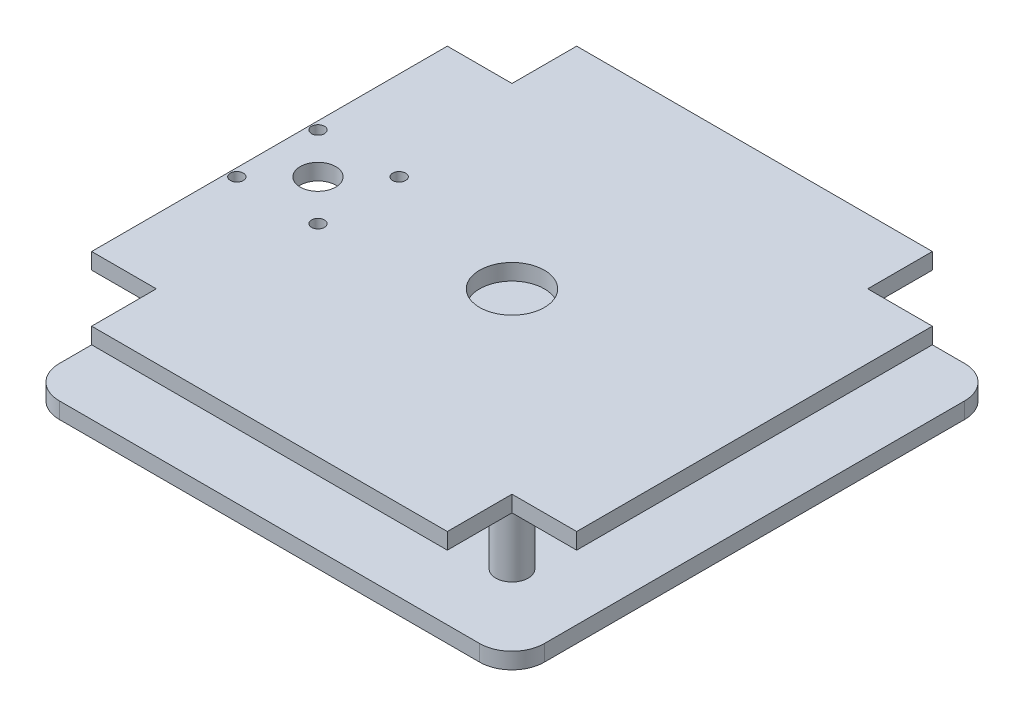
ISO-10303-21;
HEADER;
FILE_DESCRIPTION(('STEP AP214'),'2;1');
FILE_NAME('part.step','',(''),(''),'','','');
FILE_SCHEMA(('AUTOMOTIVE_DESIGN { 1 0 10303 214 1 1 1 1 }'));
ENDSEC;
DATA;
#1=APPLICATION_CONTEXT('core data for automotive mechanical design processes');
#2=APPLICATION_PROTOCOL_DEFINITION('international standard','automotive_design',2000,#1);
#3=PRODUCT_CONTEXT('',#1,'mechanical');
#4=PRODUCT('Part','Part','',(#3));
#5=PRODUCT_RELATED_PRODUCT_CATEGORY('part','',(#4));
#6=PRODUCT_DEFINITION_FORMATION('','',#4);
#7=PRODUCT_DEFINITION_CONTEXT('part definition',#1,'design');
#8=PRODUCT_DEFINITION('design','',#6,#7);
#9=PRODUCT_DEFINITION_SHAPE('','',#8);
#10=(LENGTH_UNIT() NAMED_UNIT(*) SI_UNIT(.MILLI.,.METRE.));
#11=(NAMED_UNIT(*) PLANE_ANGLE_UNIT() SI_UNIT($,.RADIAN.));
#12=(NAMED_UNIT(*) SI_UNIT($,.STERADIAN.) SOLID_ANGLE_UNIT());
#13=UNCERTAINTY_MEASURE_WITH_UNIT(LENGTH_MEASURE(1.E-05),#10,'distance_accuracy_value','');
#14=(GEOMETRIC_REPRESENTATION_CONTEXT(3) GLOBAL_UNCERTAINTY_ASSIGNED_CONTEXT((#13)) GLOBAL_UNIT_ASSIGNED_CONTEXT((#10,
#11,#12)) REPRESENTATION_CONTEXT('',''));
#15=CARTESIAN_POINT('',(0.,0.,0.));
#16=DIRECTION('',(0.,0.,1.));
#17=DIRECTION('',(1.,0.,0.));
#18=AXIS2_PLACEMENT_3D('',#15,#16,#17);
#19=CARTESIAN_POINT('',(75.,5.,-75.));
#20=DIRECTION('',(-1.,0.,0.));
#21=DIRECTION('',(0.,0.,1.));
#22=AXIS2_PLACEMENT_3D('',#19,#20,#21);
#23=PLANE('',#22);
#24=DIRECTION('',(0.,0.,-1.));
#25=VECTOR('',#24,1.);
#26=CARTESIAN_POINT('',(75.,5.,-75.));
#27=LINE('',#26,#25);
#28=CARTESIAN_POINT('',(75.,5.,65.));
#29=VERTEX_POINT('',#28);
#30=CARTESIAN_POINT('',(75.,5.,-65.));
#31=VERTEX_POINT('',#30);
#32=EDGE_CURVE('E264',#29,#31,#27,.T.);
#33=ORIENTED_EDGE('',*,*,#32,.F.);
#34=DIRECTION('',(0.,-1.,0.));
#35=VECTOR('',#34,1.);
#36=CARTESIAN_POINT('',(75.,5.,65.));
#37=LINE('',#36,#35);
#38=CARTESIAN_POINT('',(75.,0.,65.));
#39=VERTEX_POINT('',#38);
#40=EDGE_CURVE('E317',#29,#39,#37,.T.);
#41=ORIENTED_EDGE('',*,*,#40,.T.);
#42=DIRECTION('',(0.,0.,-1.));
#43=VECTOR('',#42,1.);
#44=CARTESIAN_POINT('',(75.,0.,-75.));
#45=LINE('',#44,#43);
#46=CARTESIAN_POINT('',(75.,0.,-65.));
#47=VERTEX_POINT('',#46);
#48=EDGE_CURVE('E261',#39,#47,#45,.T.);
#49=ORIENTED_EDGE('',*,*,#48,.T.);
#50=DIRECTION('',(0.,-1.,0.));
#51=VECTOR('',#50,1.);
#52=CARTESIAN_POINT('',(75.,5.,-65.));
#53=LINE('',#52,#51);
#54=EDGE_CURVE('E315',#47,#31,#53,.F.);
#55=ORIENTED_EDGE('',*,*,#54,.T.);
#56=EDGE_LOOP('',(#33,#41,#49,#55));
#57=FACE_BOUND('',#56,.T.);
#58=ADVANCED_FACE('F40',(#57),#23,.F.);
#59=CARTESIAN_POINT('',(-75.,5.,-75.));
#60=DIRECTION('',(0.,0.,1.));
#61=DIRECTION('',(1.,0.,0.));
#62=AXIS2_PLACEMENT_3D('',#59,#60,#61);
#63=PLANE('',#62);
#64=DIRECTION('',(-1.,0.,0.));
#65=VECTOR('',#64,1.);
#66=CARTESIAN_POINT('',(-75.,5.,-75.));
#67=LINE('',#66,#65);
#68=CARTESIAN_POINT('',(65.,5.,-75.));
#69=VERTEX_POINT('',#68);
#70=CARTESIAN_POINT('',(-65.,5.,-75.));
#71=VERTEX_POINT('',#70);
#72=EDGE_CURVE('E267',#69,#71,#67,.T.);
#73=ORIENTED_EDGE('',*,*,#72,.F.);
#74=DIRECTION('',(0.,-1.,0.));
#75=VECTOR('',#74,1.);
#76=CARTESIAN_POINT('',(65.,5.,-75.));
#77=LINE('',#76,#75);
#78=CARTESIAN_POINT('',(65.,0.,-75.));
#79=VERTEX_POINT('',#78);
#80=EDGE_CURVE('E322',#69,#79,#77,.T.);
#81=ORIENTED_EDGE('',*,*,#80,.T.);
#82=DIRECTION('',(-1.,0.,0.));
#83=VECTOR('',#82,1.);
#84=CARTESIAN_POINT('',(-75.,0.,-75.));
#85=LINE('',#84,#83);
#86=CARTESIAN_POINT('',(-65.,0.,-75.));
#87=VERTEX_POINT('',#86);
#88=EDGE_CURVE('E280',#79,#87,#85,.T.);
#89=ORIENTED_EDGE('',*,*,#88,.T.);
#90=DIRECTION('',(0.,-1.,0.));
#91=VECTOR('',#90,1.);
#92=CARTESIAN_POINT('',(-65.,5.,-75.));
#93=LINE('',#92,#91);
#94=EDGE_CURVE('E320',#87,#71,#93,.F.);
#95=ORIENTED_EDGE('',*,*,#94,.T.);
#96=EDGE_LOOP('',(#73,#81,#89,#95));
#97=FACE_BOUND('',#96,.T.);
#98=ADVANCED_FACE('F472',(#97),#63,.F.);
#99=CARTESIAN_POINT('',(-75.,5.,-75.));
#100=DIRECTION('',(1.,0.,0.));
#101=DIRECTION('',(0.,0.,-1.));
#102=AXIS2_PLACEMENT_3D('',#99,#100,#101);
#103=PLANE('',#102);
#104=DIRECTION('',(0.,0.,1.));
#105=VECTOR('',#104,1.);
#106=CARTESIAN_POINT('',(-75.,0.,-75.));
#107=LINE('',#106,#105);
#108=CARTESIAN_POINT('',(-75.,0.,-65.));
#109=VERTEX_POINT('',#108);
#110=CARTESIAN_POINT('',(-75.,0.,65.));
#111=VERTEX_POINT('',#110);
#112=EDGE_CURVE('E283',#109,#111,#107,.T.);
#113=ORIENTED_EDGE('',*,*,#112,.T.);
#114=DIRECTION('',(0.,-1.,0.));
#115=VECTOR('',#114,1.);
#116=CARTESIAN_POINT('',(-75.,5.,65.));
#117=LINE('',#116,#115);
#118=CARTESIAN_POINT('',(-75.,5.,65.));
#119=VERTEX_POINT('',#118);
#120=EDGE_CURVE('E305',#111,#119,#117,.F.);
#121=ORIENTED_EDGE('',*,*,#120,.T.);
#122=DIRECTION('',(0.,0.,1.));
#123=VECTOR('',#122,1.);
#124=CARTESIAN_POINT('',(-75.,5.,-75.));
#125=LINE('',#124,#123);
#126=CARTESIAN_POINT('',(-75.,5.,-65.));
#127=VERTEX_POINT('',#126);
#128=EDGE_CURVE('E271',#127,#119,#125,.T.);
#129=ORIENTED_EDGE('',*,*,#128,.F.);
#130=DIRECTION('',(0.,-1.,0.));
#131=VECTOR('',#130,1.);
#132=CARTESIAN_POINT('',(-75.,5.,-65.));
#133=LINE('',#132,#131);
#134=EDGE_CURVE('E302',#127,#109,#133,.T.);
#135=ORIENTED_EDGE('',*,*,#134,.T.);
#136=EDGE_LOOP('',(#113,#121,#129,#135));
#137=FACE_BOUND('',#136,.T.);
#138=ADVANCED_FACE('F475',(#137),#103,.F.);
#139=CARTESIAN_POINT('',(-75.,5.,75.));
#140=DIRECTION('',(0.,0.,-1.));
#141=DIRECTION('',(-1.,0.,0.));
#142=AXIS2_PLACEMENT_3D('',#139,#140,#141);
#143=PLANE('',#142);
#144=DIRECTION('',(1.,0.,0.));
#145=VECTOR('',#144,1.);
#146=CARTESIAN_POINT('',(-75.,5.,75.));
#147=LINE('',#146,#145);
#148=CARTESIAN_POINT('',(-65.,5.,75.));
#149=VERTEX_POINT('',#148);
#150=CARTESIAN_POINT('',(65.,5.,75.));
#151=VERTEX_POINT('',#150);
#152=EDGE_CURVE('E274',#149,#151,#147,.T.);
#153=ORIENTED_EDGE('',*,*,#152,.F.);
#154=DIRECTION('',(0.,-1.,0.));
#155=VECTOR('',#154,1.);
#156=CARTESIAN_POINT('',(-65.,5.,75.));
#157=LINE('',#156,#155);
#158=CARTESIAN_POINT('',(-65.,0.,75.));
#159=VERTEX_POINT('',#158);
#160=EDGE_CURVE('E291',#149,#159,#157,.T.);
#161=ORIENTED_EDGE('',*,*,#160,.T.);
#162=DIRECTION('',(1.,0.,0.));
#163=VECTOR('',#162,1.);
#164=CARTESIAN_POINT('',(-75.,0.,75.));
#165=LINE('',#164,#163);
#166=CARTESIAN_POINT('',(65.,0.,75.));
#167=VERTEX_POINT('',#166);
#168=EDGE_CURVE('E268',#159,#167,#165,.T.);
#169=ORIENTED_EDGE('',*,*,#168,.T.);
#170=DIRECTION('',(0.,-1.,0.));
#171=VECTOR('',#170,1.);
#172=CARTESIAN_POINT('',(65.,5.,75.));
#173=LINE('',#172,#171);
#174=EDGE_CURVE('E277',#167,#151,#173,.F.);
#175=ORIENTED_EDGE('',*,*,#174,.T.);
#176=EDGE_LOOP('',(#153,#161,#169,#175));
#177=FACE_BOUND('',#176,.T.);
#178=ADVANCED_FACE('F433',(#177),#143,.F.);
#179=CARTESIAN_POINT('',(0.,5.,0.));
#180=DIRECTION('',(0.,1.,0.));
#181=DIRECTION('',(0.,0.,1.));
#182=AXIS2_PLACEMENT_3D('',#179,#180,#181);
#183=PLANE('',#182);
#184=CARTESIAN_POINT('',(-60.,5.,0.));
#185=DIRECTION('',(0.,1.,0.));
#186=DIRECTION('',(0.,0.,1.));
#187=AXIS2_PLACEMENT_3D('',#184,#185,#186);
#188=CIRCLE('',#187,5.5);
#189=CARTESIAN_POINT('',(-60.,5.,5.5));
#190=VERTEX_POINT('',#189);
#191=EDGE_CURVE('E221',#190,#190,#188,.T.);
#192=ORIENTED_EDGE('',*,*,#191,.F.);
#193=EDGE_LOOP('',(#192));
#194=FACE_BOUND('',#193,.T.);
#195=CARTESIAN_POINT('',(0.,5.,0.));
#196=DIRECTION('',(0.,1.,0.));
#197=DIRECTION('',(0.,0.,1.));
#198=AXIS2_PLACEMENT_3D('',#195,#196,#197);
#199=CIRCLE('',#198,10.);
#200=CARTESIAN_POINT('',(0.,5.,10.));
#201=VERTEX_POINT('',#200);
#202=EDGE_CURVE('E237',#201,#201,#199,.T.);
#203=ORIENTED_EDGE('',*,*,#202,.F.);
#204=EDGE_LOOP('',(#203));
#205=FACE_BOUND('',#204,.T.);
#206=CARTESIAN_POINT('',(-50.,5.,-49.9999999999972));
#207=DIRECTION('',(0.,1.,0.));
#208=DIRECTION('',(0.,0.,1.));
#209=AXIS2_PLACEMENT_3D('',#206,#207,#208);
#210=CIRCLE('',#209,5.000000000003);
#211=CARTESIAN_POINT('',(-50.,5.,-44.9999999999942));
#212=VERTEX_POINT('',#211);
#213=EDGE_CURVE('E236',#212,#212,#210,.T.);
#214=ORIENTED_EDGE('',*,*,#213,.F.);
#215=EDGE_LOOP('',(#214));
#216=FACE_BOUND('',#215,.T.);
#217=CARTESIAN_POINT('',(-49.9999999999972,5.,50.0000000000028));
#218=DIRECTION('',(0.,1.,0.));
#219=DIRECTION('',(0.,0.,1.));
#220=AXIS2_PLACEMENT_3D('',#217,#218,#219);
#221=CIRCLE('',#220,5.00000000000206);
#222=CARTESIAN_POINT('',(-49.9999999999972,5.,55.0000000000049));
#223=VERTEX_POINT('',#222);
#224=EDGE_CURVE('E243',#223,#223,#221,.T.);
#225=ORIENTED_EDGE('',*,*,#224,.F.);
#226=EDGE_LOOP('',(#225));
#227=FACE_BOUND('',#226,.T.);
#228=CARTESIAN_POINT('',(50.0000000000028,5.,50.));
#229=DIRECTION('',(0.,1.,0.));
#230=DIRECTION('',(0.,0.,1.));
#231=AXIS2_PLACEMENT_3D('',#228,#229,#230);
#232=CIRCLE('',#231,4.99999999999929);
#233=CARTESIAN_POINT('',(50.0000000000028,5.,54.9999999999993));
#234=VERTEX_POINT('',#233);
#235=EDGE_CURVE('E249',#234,#234,#232,.T.);
#236=ORIENTED_EDGE('',*,*,#235,.F.);
#237=EDGE_LOOP('',(#236));
#238=FACE_BOUND('',#237,.T.);
#239=CARTESIAN_POINT('',(50.,5.,-50.));
#240=DIRECTION('',(0.,1.,0.));
#241=DIRECTION('',(0.,0.,1.));
#242=AXIS2_PLACEMENT_3D('',#239,#240,#241);
#243=CIRCLE('',#242,5.);
#244=CARTESIAN_POINT('',(50.,5.,-45.));
#245=VERTEX_POINT('',#244);
#246=EDGE_CURVE('E255',#245,#245,#243,.T.);
#247=ORIENTED_EDGE('',*,*,#246,.F.);
#248=EDGE_LOOP('',(#247));
#249=FACE_BOUND('',#248,.T.);
#250=ORIENTED_EDGE('',*,*,#128,.T.);
#251=CARTESIAN_POINT('',(-65.,5.,65.));
#252=DIRECTION('',(0.,1.,0.));
#253=DIRECTION('',(0.,0.,1.));
#254=AXIS2_PLACEMENT_3D('',#251,#252,#253);
#255=CIRCLE('',#254,10.);
#256=EDGE_CURVE('E313',#119,#149,#255,.T.);
#257=ORIENTED_EDGE('',*,*,#256,.T.);
#258=ORIENTED_EDGE('',*,*,#152,.T.);
#259=CARTESIAN_POINT('',(65.,5.,65.));
#260=DIRECTION('',(0.,1.,0.));
#261=DIRECTION('',(0.,0.,1.));
#262=AXIS2_PLACEMENT_3D('',#259,#260,#261);
#263=CIRCLE('',#262,10.);
#264=EDGE_CURVE('E311',#151,#29,#263,.T.);
#265=ORIENTED_EDGE('',*,*,#264,.T.);
#266=ORIENTED_EDGE('',*,*,#32,.T.);
#267=CARTESIAN_POINT('',(65.,5.,-65.));
#268=DIRECTION('',(0.,1.,0.));
#269=DIRECTION('',(0.,0.,1.));
#270=AXIS2_PLACEMENT_3D('',#267,#268,#269);
#271=CIRCLE('',#270,10.);
#272=EDGE_CURVE('E309',#31,#69,#271,.T.);
#273=ORIENTED_EDGE('',*,*,#272,.T.);
#274=ORIENTED_EDGE('',*,*,#72,.T.);
#275=CARTESIAN_POINT('',(-65.,5.,-65.));
#276=DIRECTION('',(0.,1.,0.));
#277=DIRECTION('',(0.,0.,1.));
#278=AXIS2_PLACEMENT_3D('',#275,#276,#277);
#279=CIRCLE('',#278,10.);
#280=EDGE_CURVE('E307',#71,#127,#279,.T.);
#281=ORIENTED_EDGE('',*,*,#280,.T.);
#282=EDGE_LOOP('',(#250,#257,#258,#265,#266,#273,#274,#281));
#283=FACE_BOUND('',#282,.T.);
#284=ADVANCED_FACE('F429',(#194,#205,#216,#227,#238,#249,#283),#183,.T.);
#285=CARTESIAN_POINT('',(0.,0.,0.));
#286=DIRECTION('',(0.,1.,0.));
#287=DIRECTION('',(0.,0.,1.));
#288=AXIS2_PLACEMENT_3D('',#285,#286,#287);
#289=PLANE('',#288);
#290=CARTESIAN_POINT('',(-60.,0.,0.));
#291=DIRECTION('',(0.,1.,0.));
#292=DIRECTION('',(0.,0.,1.));
#293=AXIS2_PLACEMENT_3D('',#290,#291,#292);
#294=CIRCLE('',#293,5.5);
#295=CARTESIAN_POINT('',(-60.,0.,5.5));
#296=VERTEX_POINT('',#295);
#297=EDGE_CURVE('E232',#296,#296,#294,.T.);
#298=ORIENTED_EDGE('',*,*,#297,.T.);
#299=EDGE_LOOP('',(#298));
#300=FACE_BOUND('',#299,.T.);
#301=CARTESIAN_POINT('',(0.,0.,0.));
#302=DIRECTION('',(0.,1.,0.));
#303=DIRECTION('',(0.,0.,1.));
#304=AXIS2_PLACEMENT_3D('',#301,#302,#303);
#305=CIRCLE('',#304,10.);
#306=CARTESIAN_POINT('',(0.,0.,10.));
#307=VERTEX_POINT('',#306);
#308=EDGE_CURVE('E233',#307,#307,#305,.T.);
#309=ORIENTED_EDGE('',*,*,#308,.T.);
#310=EDGE_LOOP('',(#309));
#311=FACE_BOUND('',#310,.T.);
#312=ORIENTED_EDGE('',*,*,#168,.F.);
#313=CARTESIAN_POINT('',(-65.,0.,65.));
#314=DIRECTION('',(0.,1.,0.));
#315=DIRECTION('',(0.,0.,1.));
#316=AXIS2_PLACEMENT_3D('',#313,#314,#315);
#317=CIRCLE('',#316,10.);
#318=EDGE_CURVE('E300',#159,#111,#317,.F.);
#319=ORIENTED_EDGE('',*,*,#318,.T.);
#320=ORIENTED_EDGE('',*,*,#112,.F.);
#321=CARTESIAN_POINT('',(-65.,0.,-65.));
#322=DIRECTION('',(0.,1.,0.));
#323=DIRECTION('',(0.,0.,1.));
#324=AXIS2_PLACEMENT_3D('',#321,#322,#323);
#325=CIRCLE('',#324,10.);
#326=EDGE_CURVE('E294',#109,#87,#325,.F.);
#327=ORIENTED_EDGE('',*,*,#326,.T.);
#328=ORIENTED_EDGE('',*,*,#88,.F.);
#329=CARTESIAN_POINT('',(65.,0.,-65.));
#330=DIRECTION('',(0.,1.,0.));
#331=DIRECTION('',(0.,0.,1.));
#332=AXIS2_PLACEMENT_3D('',#329,#330,#331);
#333=CIRCLE('',#332,10.);
#334=EDGE_CURVE('E296',#79,#47,#333,.F.);
#335=ORIENTED_EDGE('',*,*,#334,.T.);
#336=ORIENTED_EDGE('',*,*,#48,.F.);
#337=CARTESIAN_POINT('',(65.,0.,65.));
#338=DIRECTION('',(0.,1.,0.));
#339=DIRECTION('',(0.,0.,1.));
#340=AXIS2_PLACEMENT_3D('',#337,#338,#339);
#341=CIRCLE('',#340,10.);
#342=EDGE_CURVE('E298',#39,#167,#341,.F.);
#343=ORIENTED_EDGE('',*,*,#342,.T.);
#344=EDGE_LOOP('',(#312,#319,#320,#327,#328,#335,#336,#343));
#345=FACE_BOUND('',#344,.T.);
#346=ADVANCED_FACE('F432',(#300,#311,#345),#289,.F.);
#347=CARTESIAN_POINT('',(50.,25.,-50.));
#348=DIRECTION('',(0.,-1.,0.));
#349=DIRECTION('',(0.,0.,-1.));
#350=AXIS2_PLACEMENT_3D('',#347,#348,#349);
#351=CYLINDRICAL_SURFACE('',#350,5.);
#352=CARTESIAN_POINT('',(50.,25.,-50.));
#353=DIRECTION('',(0.,1.,0.));
#354=DIRECTION('',(0.,0.,1.));
#355=AXIS2_PLACEMENT_3D('',#352,#353,#354);
#356=CIRCLE('',#355,5.);
#357=CARTESIAN_POINT('',(50.,25.,-45.));
#358=VERTEX_POINT('',#357);
#359=EDGE_CURVE('E258',#358,#358,#356,.T.);
#360=ORIENTED_EDGE('',*,*,#359,.F.);
#361=EDGE_LOOP('',(#360));
#362=FACE_BOUND('',#361,.T.);
#363=ORIENTED_EDGE('',*,*,#246,.T.);
#364=EDGE_LOOP('',(#363));
#365=FACE_BOUND('',#364,.T.);
#366=ADVANCED_FACE('F521',(#362,#365),#351,.T.);
#367=CARTESIAN_POINT('',(50.0000000000028,25.,50.));
#368=DIRECTION('',(0.,-1.,0.));
#369=DIRECTION('',(0.,0.,-1.));
#370=AXIS2_PLACEMENT_3D('',#367,#368,#369);
#371=CYLINDRICAL_SURFACE('',#370,4.99999999999929);
#372=CARTESIAN_POINT('',(50.0000000000028,25.,50.));
#373=DIRECTION('',(0.,1.,0.));
#374=DIRECTION('',(0.,0.,1.));
#375=AXIS2_PLACEMENT_3D('',#372,#373,#374);
#376=CIRCLE('',#375,4.99999999999929);
#377=CARTESIAN_POINT('',(50.0000000000028,25.,54.9999999999993));
#378=VERTEX_POINT('',#377);
#379=EDGE_CURVE('E252',#378,#378,#376,.T.);
#380=ORIENTED_EDGE('',*,*,#379,.F.);
#381=EDGE_LOOP('',(#380));
#382=FACE_BOUND('',#381,.T.);
#383=ORIENTED_EDGE('',*,*,#235,.T.);
#384=EDGE_LOOP('',(#383));
#385=FACE_BOUND('',#384,.T.);
#386=ADVANCED_FACE('F517',(#382,#385),#371,.T.);
#387=CARTESIAN_POINT('',(-49.9999999999972,25.,50.0000000000028));
#388=DIRECTION('',(0.,-1.,0.));
#389=DIRECTION('',(0.,0.,-1.));
#390=AXIS2_PLACEMENT_3D('',#387,#388,#389);
#391=CYLINDRICAL_SURFACE('',#390,5.00000000000206);
#392=CARTESIAN_POINT('',(-49.9999999999972,25.,50.0000000000028));
#393=DIRECTION('',(0.,1.,0.));
#394=DIRECTION('',(0.,0.,1.));
#395=AXIS2_PLACEMENT_3D('',#392,#393,#394);
#396=CIRCLE('',#395,5.00000000000206);
#397=CARTESIAN_POINT('',(-49.9999999999972,25.,55.0000000000049));
#398=VERTEX_POINT('',#397);
#399=EDGE_CURVE('E246',#398,#398,#396,.T.);
#400=ORIENTED_EDGE('',*,*,#399,.F.);
#401=EDGE_LOOP('',(#400));
#402=FACE_BOUND('',#401,.T.);
#403=ORIENTED_EDGE('',*,*,#224,.T.);
#404=EDGE_LOOP('',(#403));
#405=FACE_BOUND('',#404,.T.);
#406=ADVANCED_FACE('F425',(#402,#405),#391,.T.);
#407=CARTESIAN_POINT('',(-50.,25.,-49.9999999999972));
#408=DIRECTION('',(0.,-1.,0.));
#409=DIRECTION('',(0.,0.,-1.));
#410=AXIS2_PLACEMENT_3D('',#407,#408,#409);
#411=CYLINDRICAL_SURFACE('',#410,5.000000000003);
#412=CARTESIAN_POINT('',(-50.,25.,-49.9999999999972));
#413=DIRECTION('',(0.,1.,0.));
#414=DIRECTION('',(0.,0.,1.));
#415=AXIS2_PLACEMENT_3D('',#412,#413,#414);
#416=CIRCLE('',#415,5.000000000003);
#417=CARTESIAN_POINT('',(-50.,25.,-44.9999999999942));
#418=VERTEX_POINT('',#417);
#419=EDGE_CURVE('E240',#418,#418,#416,.T.);
#420=ORIENTED_EDGE('',*,*,#419,.F.);
#421=EDGE_LOOP('',(#420));
#422=FACE_BOUND('',#421,.T.);
#423=ORIENTED_EDGE('',*,*,#213,.T.);
#424=EDGE_LOOP('',(#423));
#425=FACE_BOUND('',#424,.T.);
#426=ADVANCED_FACE('F421',(#422,#425),#411,.T.);
#427=CARTESIAN_POINT('',(0.,0.,0.));
#428=DIRECTION('',(0.,1.,0.));
#429=DIRECTION('',(0.,0.,1.));
#430=AXIS2_PLACEMENT_3D('',#427,#428,#429);
#431=CYLINDRICAL_SURFACE('',#430,10.);
#432=ORIENTED_EDGE('',*,*,#308,.F.);
#433=EDGE_LOOP('',(#432));
#434=FACE_BOUND('',#433,.T.);
#435=ORIENTED_EDGE('',*,*,#202,.T.);
#436=EDGE_LOOP('',(#435));
#437=FACE_BOUND('',#436,.T.);
#438=ADVANCED_FACE('F424',(#434,#437),#431,.F.);
#439=CARTESIAN_POINT('',(-60.,-15.,0.));
#440=DIRECTION('',(0.,1.,0.));
#441=DIRECTION('',(0.,0.,1.));
#442=AXIS2_PLACEMENT_3D('',#439,#440,#441);
#443=CYLINDRICAL_SURFACE('',#442,5.5);
#444=ORIENTED_EDGE('',*,*,#191,.T.);
#445=EDGE_LOOP('',(#444));
#446=FACE_BOUND('',#445,.T.);
#447=ORIENTED_EDGE('',*,*,#297,.F.);
#448=EDGE_LOOP('',(#447));
#449=FACE_BOUND('',#448,.T.);
#450=ADVANCED_FACE('F491',(#446,#449),#443,.F.);
#451=CARTESIAN_POINT('',(-65.,5.,65.));
#452=DIRECTION('',(0.,-1.,0.));
#453=DIRECTION('',(0.,0.,-1.));
#454=AXIS2_PLACEMENT_3D('',#451,#452,#453);
#455=CYLINDRICAL_SURFACE('',#454,10.);
#456=ORIENTED_EDGE('',*,*,#256,.F.);
#457=ORIENTED_EDGE('',*,*,#120,.F.);
#458=ORIENTED_EDGE('',*,*,#318,.F.);
#459=ORIENTED_EDGE('',*,*,#160,.F.);
#460=EDGE_LOOP('',(#456,#457,#458,#459));
#461=FACE_BOUND('',#460,.T.);
#462=ADVANCED_FACE('F451',(#461),#455,.T.);
#463=CARTESIAN_POINT('',(65.,5.,65.));
#464=DIRECTION('',(0.,-1.,0.));
#465=DIRECTION('',(0.,0.,-1.));
#466=AXIS2_PLACEMENT_3D('',#463,#464,#465);
#467=CYLINDRICAL_SURFACE('',#466,10.);
#468=ORIENTED_EDGE('',*,*,#264,.F.);
#469=ORIENTED_EDGE('',*,*,#174,.F.);
#470=ORIENTED_EDGE('',*,*,#342,.F.);
#471=ORIENTED_EDGE('',*,*,#40,.F.);
#472=EDGE_LOOP('',(#468,#469,#470,#471));
#473=FACE_BOUND('',#472,.T.);
#474=ADVANCED_FACE('F461',(#473),#467,.T.);
#475=CARTESIAN_POINT('',(65.,5.,-65.));
#476=DIRECTION('',(0.,-1.,0.));
#477=DIRECTION('',(0.,0.,-1.));
#478=AXIS2_PLACEMENT_3D('',#475,#476,#477);
#479=CYLINDRICAL_SURFACE('',#478,10.);
#480=ORIENTED_EDGE('',*,*,#272,.F.);
#481=ORIENTED_EDGE('',*,*,#54,.F.);
#482=ORIENTED_EDGE('',*,*,#334,.F.);
#483=ORIENTED_EDGE('',*,*,#80,.F.);
#484=EDGE_LOOP('',(#480,#481,#482,#483));
#485=FACE_BOUND('',#484,.T.);
#486=ADVANCED_FACE('F469',(#485),#479,.T.);
#487=CARTESIAN_POINT('',(-65.,5.,-65.));
#488=DIRECTION('',(0.,-1.,0.));
#489=DIRECTION('',(0.,0.,-1.));
#490=AXIS2_PLACEMENT_3D('',#487,#488,#489);
#491=CYLINDRICAL_SURFACE('',#490,10.);
#492=ORIENTED_EDGE('',*,*,#280,.F.);
#493=ORIENTED_EDGE('',*,*,#94,.F.);
#494=ORIENTED_EDGE('',*,*,#326,.F.);
#495=ORIENTED_EDGE('',*,*,#134,.F.);
#496=EDGE_LOOP('',(#492,#493,#494,#495));
#497=FACE_BOUND('',#496,.T.);
#498=ADVANCED_FACE('F42',(#497),#491,.T.);
#499=CARTESIAN_POINT('',(0.,30.,-75.));
#500=DIRECTION('',(0.,0.,1.));
#501=DIRECTION('',(1.,0.,0.));
#502=AXIS2_PLACEMENT_3D('',#499,#500,#501);
#503=PLANE('',#502);
#504=DIRECTION('',(-1.,0.,0.));
#505=VECTOR('',#504,1.);
#506=CARTESIAN_POINT('',(0.,30.,-75.));
#507=LINE('',#506,#505);
#508=CARTESIAN_POINT('',(55.,30.,-75.0000000000125));
#509=VERTEX_POINT('',#508);
#510=CARTESIAN_POINT('',(-55.,30.,-75.));
#511=VERTEX_POINT('',#510);
#512=EDGE_CURVE('E197',#509,#511,#507,.T.);
#513=ORIENTED_EDGE('',*,*,#512,.F.);
#514=DIRECTION('',(0.,1.,0.));
#515=VECTOR('',#514,1.);
#516=CARTESIAN_POINT('',(55.,20.,-75.0000000000125));
#517=LINE('',#516,#515);
#518=CARTESIAN_POINT('',(55.,25.,-75.0000000000125));
#519=VERTEX_POINT('',#518);
#520=EDGE_CURVE('E177',#519,#509,#517,.T.);
#521=ORIENTED_EDGE('',*,*,#520,.F.);
#522=DIRECTION('',(-1.,0.,0.));
#523=VECTOR('',#522,1.);
#524=CARTESIAN_POINT('',(0.,25.,-75.));
#525=LINE('',#524,#523);
#526=CARTESIAN_POINT('',(-55.,25.,-75.));
#527=VERTEX_POINT('',#526);
#528=EDGE_CURVE('E222',#519,#527,#525,.T.);
#529=ORIENTED_EDGE('',*,*,#528,.T.);
#530=DIRECTION('',(0.,1.,0.));
#531=VECTOR('',#530,1.);
#532=CARTESIAN_POINT('',(-55.,20.,-75.));
#533=LINE('',#532,#531);
#534=EDGE_CURVE('E203',#527,#511,#533,.T.);
#535=ORIENTED_EDGE('',*,*,#534,.T.);
#536=EDGE_LOOP('',(#513,#521,#529,#535));
#537=FACE_BOUND('',#536,.T.);
#538=ADVANCED_FACE('F202',(#537),#503,.F.);
#539=CARTESIAN_POINT('',(-75.,30.,0.));
#540=DIRECTION('',(1.,0.,0.));
#541=DIRECTION('',(0.,0.,-1.));
#542=AXIS2_PLACEMENT_3D('',#539,#540,#541);
#543=PLANE('',#542);
#544=DIRECTION('',(0.,0.,1.));
#545=VECTOR('',#544,1.);
#546=CARTESIAN_POINT('',(-75.,25.,0.));
#547=LINE('',#546,#545);
#548=CARTESIAN_POINT('',(-75.,25.,-55.));
#549=VERTEX_POINT('',#548);
#550=CARTESIAN_POINT('',(-74.9999999999875,25.,55.));
#551=VERTEX_POINT('',#550);
#552=EDGE_CURVE('E224',#549,#551,#547,.T.);
#553=ORIENTED_EDGE('',*,*,#552,.T.);
#554=DIRECTION('',(0.,1.,0.));
#555=VECTOR('',#554,1.);
#556=CARTESIAN_POINT('',(-74.9999999999875,20.,55.));
#557=LINE('',#556,#555);
#558=CARTESIAN_POINT('',(-74.9999999999875,30.,55.));
#559=VERTEX_POINT('',#558);
#560=EDGE_CURVE('E355',#551,#559,#557,.T.);
#561=ORIENTED_EDGE('',*,*,#560,.T.);
#562=DIRECTION('',(0.,0.,1.));
#563=VECTOR('',#562,1.);
#564=CARTESIAN_POINT('',(-75.,30.,0.));
#565=LINE('',#564,#563);
#566=CARTESIAN_POINT('',(-75.,30.,-55.));
#567=VERTEX_POINT('',#566);
#568=EDGE_CURVE('E204',#567,#559,#565,.T.);
#569=ORIENTED_EDGE('',*,*,#568,.F.);
#570=DIRECTION('',(0.,1.,0.));
#571=VECTOR('',#570,1.);
#572=CARTESIAN_POINT('',(-75.,20.,-55.));
#573=LINE('',#572,#571);
#574=EDGE_CURVE('E367',#549,#567,#573,.T.);
#575=ORIENTED_EDGE('',*,*,#574,.F.);
#576=EDGE_LOOP('',(#553,#561,#569,#575));
#577=FACE_BOUND('',#576,.T.);
#578=ADVANCED_FACE('F500',(#577),#543,.F.);
#579=CARTESIAN_POINT('',(0.,30.,75.));
#580=DIRECTION('',(0.,0.,-1.));
#581=DIRECTION('',(-1.,0.,0.));
#582=AXIS2_PLACEMENT_3D('',#579,#580,#581);
#583=PLANE('',#582);
#584=DIRECTION('',(1.,0.,0.));
#585=VECTOR('',#584,1.);
#586=CARTESIAN_POINT('',(0.,30.,75.));
#587=LINE('',#586,#585);
#588=CARTESIAN_POINT('',(-54.9999999999875,30.,75.0000000000001));
#589=VERTEX_POINT('',#588);
#590=CARTESIAN_POINT('',(55.0000000000125,30.,74.9999999999876));
#591=VERTEX_POINT('',#590);
#592=EDGE_CURVE('E208',#589,#591,#587,.T.);
#593=ORIENTED_EDGE('',*,*,#592,.F.);
#594=DIRECTION('',(0.,1.,0.));
#595=VECTOR('',#594,1.);
#596=CARTESIAN_POINT('',(-54.9999999999875,20.,75.0000000000001));
#597=LINE('',#596,#595);
#598=CARTESIAN_POINT('',(-54.9999999999875,25.,75.0000000000001));
#599=VERTEX_POINT('',#598);
#600=EDGE_CURVE('E347',#599,#589,#597,.T.);
#601=ORIENTED_EDGE('',*,*,#600,.F.);
#602=DIRECTION('',(1.,0.,0.));
#603=VECTOR('',#602,1.);
#604=CARTESIAN_POINT('',(0.,25.,75.));
#605=LINE('',#604,#603);
#606=CARTESIAN_POINT('',(55.0000000000125,25.,74.9999999999876));
#607=VERTEX_POINT('',#606);
#608=EDGE_CURVE('E211',#599,#607,#605,.T.);
#609=ORIENTED_EDGE('',*,*,#608,.T.);
#610=DIRECTION('',(0.,1.,0.));
#611=VECTOR('',#610,1.);
#612=CARTESIAN_POINT('',(55.0000000000125,20.,74.9999999999876));
#613=LINE('',#612,#611);
#614=EDGE_CURVE('E199',#607,#591,#613,.T.);
#615=ORIENTED_EDGE('',*,*,#614,.T.);
#616=EDGE_LOOP('',(#593,#601,#609,#615));
#617=FACE_BOUND('',#616,.T.);
#618=ADVANCED_FACE('F351',(#617),#583,.F.);
#619=CARTESIAN_POINT('',(75.,30.,0.));
#620=DIRECTION('',(-1.,0.,0.));
#621=DIRECTION('',(0.,0.,1.));
#622=AXIS2_PLACEMENT_3D('',#619,#620,#621);
#623=PLANE('',#622);
#624=DIRECTION('',(0.,0.,-1.));
#625=VECTOR('',#624,1.);
#626=CARTESIAN_POINT('',(75.,30.,0.));
#627=LINE('',#626,#625);
#628=CARTESIAN_POINT('',(75.0000000000125,30.,54.9999999999875));
#629=VERTEX_POINT('',#628);
#630=CARTESIAN_POINT('',(75.,30.,-55.0000000000125));
#631=VERTEX_POINT('',#630);
#632=EDGE_CURVE('E219',#629,#631,#627,.T.);
#633=ORIENTED_EDGE('',*,*,#632,.F.);
#634=DIRECTION('',(0.,1.,0.));
#635=VECTOR('',#634,1.);
#636=CARTESIAN_POINT('',(75.0000000000125,20.,54.9999999999875));
#637=LINE('',#636,#635);
#638=CARTESIAN_POINT('',(75.0000000000125,25.,54.9999999999875));
#639=VERTEX_POINT('',#638);
#640=EDGE_CURVE('E768',#639,#629,#637,.T.);
#641=ORIENTED_EDGE('',*,*,#640,.F.);
#642=DIRECTION('',(0.,0.,-1.));
#643=VECTOR('',#642,1.);
#644=CARTESIAN_POINT('',(75.,25.,0.));
#645=LINE('',#644,#643);
#646=CARTESIAN_POINT('',(75.,25.,-55.0000000000125));
#647=VERTEX_POINT('',#646);
#648=EDGE_CURVE('E205',#639,#647,#645,.T.);
#649=ORIENTED_EDGE('',*,*,#648,.T.);
#650=DIRECTION('',(0.,1.,0.));
#651=VECTOR('',#650,1.);
#652=CARTESIAN_POINT('',(75.,20.,-55.0000000000125));
#653=LINE('',#652,#651);
#654=EDGE_CURVE('E365',#647,#631,#653,.T.);
#655=ORIENTED_EDGE('',*,*,#654,.T.);
#656=EDGE_LOOP('',(#633,#641,#649,#655));
#657=FACE_BOUND('',#656,.T.);
#658=ADVANCED_FACE('F662',(#657),#623,.F.);
#659=CARTESIAN_POINT('',(0.,30.,0.));
#660=DIRECTION('',(0.,1.,0.));
#661=DIRECTION('',(0.,0.,1.));
#662=AXIS2_PLACEMENT_3D('',#659,#660,#661);
#663=PLANE('',#662);
#664=DIRECTION('',(-1.,0.,0.));
#665=VECTOR('',#664,1.);
#666=CARTESIAN_POINT('',(-54.9999999999875,30.,55.));
#667=LINE('',#666,#665);
#668=CARTESIAN_POINT('',(-54.9999999999875,30.,55.));
#669=VERTEX_POINT('',#668);
#670=EDGE_CURVE('E353',#669,#559,#667,.T.);
#671=ORIENTED_EDGE('',*,*,#670,.F.);
#672=DIRECTION('',(0.,0.,-1.));
#673=VECTOR('',#672,1.);
#674=CARTESIAN_POINT('',(-54.9999999999875,30.,75.0000000000001));
#675=LINE('',#674,#673);
#676=EDGE_CURVE('E357',#589,#669,#675,.T.);
#677=ORIENTED_EDGE('',*,*,#676,.F.);
#678=ORIENTED_EDGE('',*,*,#592,.T.);
#679=DIRECTION('',(0.,0.,1.));
#680=VECTOR('',#679,1.);
#681=CARTESIAN_POINT('',(55.0000000000125,30.,54.9999999999875));
#682=LINE('',#681,#680);
#683=CARTESIAN_POINT('',(55.0000000000125,30.,54.9999999999875));
#684=VERTEX_POINT('',#683);
#685=EDGE_CURVE('E765',#684,#591,#682,.T.);
#686=ORIENTED_EDGE('',*,*,#685,.F.);
#687=DIRECTION('',(-1.,0.,0.));
#688=VECTOR('',#687,1.);
#689=CARTESIAN_POINT('',(75.0000000000125,30.,54.9999999999875));
#690=LINE('',#689,#688);
#691=EDGE_CURVE('E764',#629,#684,#690,.T.);
#692=ORIENTED_EDGE('',*,*,#691,.F.);
#693=ORIENTED_EDGE('',*,*,#632,.T.);
#694=DIRECTION('',(1.,0.,0.));
#695=VECTOR('',#694,1.);
#696=CARTESIAN_POINT('',(55.,30.,-55.0000000000125));
#697=LINE('',#696,#695);
#698=CARTESIAN_POINT('',(55.,30.,-55.0000000000125));
#699=VERTEX_POINT('',#698);
#700=EDGE_CURVE('E189',#699,#631,#697,.T.);
#701=ORIENTED_EDGE('',*,*,#700,.F.);
#702=DIRECTION('',(0.,0.,1.));
#703=VECTOR('',#702,1.);
#704=CARTESIAN_POINT('',(55.,30.,-75.0000000000125));
#705=LINE('',#704,#703);
#706=EDGE_CURVE('E180',#509,#699,#705,.T.);
#707=ORIENTED_EDGE('',*,*,#706,.F.);
#708=ORIENTED_EDGE('',*,*,#512,.T.);
#709=DIRECTION('',(0.,0.,-1.));
#710=VECTOR('',#709,1.);
#711=CARTESIAN_POINT('',(-55.,30.,-55.));
#712=LINE('',#711,#710);
#713=CARTESIAN_POINT('',(-55.,30.,-55.));
#714=VERTEX_POINT('',#713);
#715=EDGE_CURVE('E364',#714,#511,#712,.T.);
#716=ORIENTED_EDGE('',*,*,#715,.F.);
#717=DIRECTION('',(1.,0.,0.));
#718=VECTOR('',#717,1.);
#719=CARTESIAN_POINT('',(-75.,30.,-55.));
#720=LINE('',#719,#718);
#721=EDGE_CURVE('E361',#567,#714,#720,.T.);
#722=ORIENTED_EDGE('',*,*,#721,.F.);
#723=ORIENTED_EDGE('',*,*,#568,.T.);
#724=EDGE_LOOP('',(#671,#677,#678,#686,#692,#693,#701,#707,#708,#716,#722,#723));
#725=FACE_BOUND('',#724,.T.);
#726=CARTESIAN_POINT('',(-72.5511453660611,30.,-12.5511453660609));
#727=DIRECTION('',(0.,1.,0.));
#728=DIRECTION('',(0.,0.,1.));
#729=AXIS2_PLACEMENT_3D('',#726,#727,#728);
#730=CIRCLE('',#729,2.00000000000001);
#731=CARTESIAN_POINT('',(-72.5511453660611,30.,-10.5511453660609));
#732=VERTEX_POINT('',#731);
#733=EDGE_CURVE('E369',#732,#732,#730,.T.);
#734=ORIENTED_EDGE('',*,*,#733,.F.);
#735=EDGE_LOOP('',(#734));
#736=FACE_BOUND('',#735,.T.);
#737=CARTESIAN_POINT('',(-72.5511453660609,30.,12.5511453660615));
#738=DIRECTION('',(0.,1.,0.));
#739=DIRECTION('',(0.,0.,1.));
#740=AXIS2_PLACEMENT_3D('',#737,#738,#739);
#741=CIRCLE('',#740,2.);
#742=CARTESIAN_POINT('',(-72.5511453660609,30.,14.5511453660616));
#743=VERTEX_POINT('',#742);
#744=EDGE_CURVE('E383',#743,#743,#741,.T.);
#745=ORIENTED_EDGE('',*,*,#744,.F.);
#746=EDGE_LOOP('',(#745));
#747=FACE_BOUND('',#746,.T.);
#748=CARTESIAN_POINT('',(-47.4488546339384,30.,12.5511453660612));
#749=DIRECTION('',(0.,1.,0.));
#750=DIRECTION('',(0.,0.,1.));
#751=AXIS2_PLACEMENT_3D('',#748,#749,#750);
#752=CIRCLE('',#751,2.00000000000001);
#753=CARTESIAN_POINT('',(-47.4488546339384,30.,14.5511453660612));
#754=VERTEX_POINT('',#753);
#755=EDGE_CURVE('E377',#754,#754,#752,.T.);
#756=ORIENTED_EDGE('',*,*,#755,.F.);
#757=EDGE_LOOP('',(#756));
#758=FACE_BOUND('',#757,.T.);
#759=CARTESIAN_POINT('',(-47.4488546339389,30.,-12.5511453660613));
#760=DIRECTION('',(0.,1.,0.));
#761=DIRECTION('',(0.,0.,1.));
#762=AXIS2_PLACEMENT_3D('',#759,#760,#761);
#763=CIRCLE('',#762,2.00000000000001);
#764=CARTESIAN_POINT('',(-47.4488546339389,30.,-10.5511453660613));
#765=VERTEX_POINT('',#764);
#766=EDGE_CURVE('E376',#765,#765,#763,.T.);
#767=ORIENTED_EDGE('',*,*,#766,.F.);
#768=EDGE_LOOP('',(#767));
#769=FACE_BOUND('',#768,.T.);
#770=CARTESIAN_POINT('',(0.,30.,0.));
#771=DIRECTION('',(0.,-1.,0.));
#772=DIRECTION('',(0.,0.,-1.));
#773=AXIS2_PLACEMENT_3D('',#770,#771,#772);
#774=CIRCLE('',#773,10.);
#775=CARTESIAN_POINT('',(0.,30.,-10.));
#776=VERTEX_POINT('',#775);
#777=EDGE_CURVE('E225',#776,#776,#774,.T.);
#778=ORIENTED_EDGE('',*,*,#777,.T.);
#779=EDGE_LOOP('',(#778));
#780=FACE_BOUND('',#779,.T.);
#781=CARTESIAN_POINT('',(-60.,30.,0.));
#782=DIRECTION('',(0.,-1.,0.));
#783=DIRECTION('',(0.,0.,-1.));
#784=AXIS2_PLACEMENT_3D('',#781,#782,#783);
#785=CIRCLE('',#784,5.5);
#786=CARTESIAN_POINT('',(-60.,30.,-5.5));
#787=VERTEX_POINT('',#786);
#788=EDGE_CURVE('E400',#787,#787,#785,.T.);
#789=ORIENTED_EDGE('',*,*,#788,.T.);
#790=EDGE_LOOP('',(#789));
#791=FACE_BOUND('',#790,.T.);
#792=ADVANCED_FACE('F194',(#725,#736,#747,#758,#769,#780,#791),#663,.T.);
#793=CARTESIAN_POINT('',(0.,25.,0.));
#794=DIRECTION('',(0.,1.,0.));
#795=DIRECTION('',(0.,0.,1.));
#796=AXIS2_PLACEMENT_3D('',#793,#794,#795);
#797=PLANE('',#796);
#798=CARTESIAN_POINT('',(-72.5511453660611,25.,-12.5511453660609));
#799=DIRECTION('',(0.,1.,0.));
#800=DIRECTION('',(0.,0.,1.));
#801=AXIS2_PLACEMENT_3D('',#798,#799,#800);
#802=CIRCLE('',#801,2.00000000000001);
#803=CARTESIAN_POINT('',(-72.5511453660611,25.,-10.5511453660609));
#804=VERTEX_POINT('',#803);
#805=EDGE_CURVE('E386',#804,#804,#802,.T.);
#806=ORIENTED_EDGE('',*,*,#805,.T.);
#807=EDGE_LOOP('',(#806));
#808=FACE_BOUND('',#807,.T.);
#809=CARTESIAN_POINT('',(-72.5511453660609,25.,12.5511453660615));
#810=DIRECTION('',(0.,1.,0.));
#811=DIRECTION('',(0.,0.,1.));
#812=AXIS2_PLACEMENT_3D('',#809,#810,#811);
#813=CIRCLE('',#812,2.);
#814=CARTESIAN_POINT('',(-72.5511453660609,25.,14.5511453660616));
#815=VERTEX_POINT('',#814);
#816=EDGE_CURVE('E380',#815,#815,#813,.T.);
#817=ORIENTED_EDGE('',*,*,#816,.T.);
#818=EDGE_LOOP('',(#817));
#819=FACE_BOUND('',#818,.T.);
#820=CARTESIAN_POINT('',(-47.4488546339384,25.,12.5511453660612));
#821=DIRECTION('',(0.,1.,0.));
#822=DIRECTION('',(0.,0.,1.));
#823=AXIS2_PLACEMENT_3D('',#820,#821,#822);
#824=CIRCLE('',#823,2.00000000000001);
#825=CARTESIAN_POINT('',(-47.4488546339384,25.,14.5511453660612));
#826=VERTEX_POINT('',#825);
#827=EDGE_CURVE('E373',#826,#826,#824,.T.);
#828=ORIENTED_EDGE('',*,*,#827,.T.);
#829=EDGE_LOOP('',(#828));
#830=FACE_BOUND('',#829,.T.);
#831=CARTESIAN_POINT('',(-47.4488546339389,25.,-12.5511453660613));
#832=DIRECTION('',(0.,1.,0.));
#833=DIRECTION('',(0.,0.,1.));
#834=AXIS2_PLACEMENT_3D('',#831,#832,#833);
#835=CIRCLE('',#834,2.00000000000001);
#836=CARTESIAN_POINT('',(-47.4488546339389,25.,-10.5511453660613));
#837=VERTEX_POINT('',#836);
#838=EDGE_CURVE('E391',#837,#837,#835,.T.);
#839=ORIENTED_EDGE('',*,*,#838,.T.);
#840=EDGE_LOOP('',(#839));
#841=FACE_BOUND('',#840,.T.);
#842=CARTESIAN_POINT('',(0.,25.,0.));
#843=DIRECTION('',(0.,-1.,0.));
#844=DIRECTION('',(0.,0.,-1.));
#845=AXIS2_PLACEMENT_3D('',#842,#843,#844);
#846=CIRCLE('',#845,10.);
#847=CARTESIAN_POINT('',(0.,25.,-10.));
#848=VERTEX_POINT('',#847);
#849=EDGE_CURVE('E398',#848,#848,#846,.T.);
#850=ORIENTED_EDGE('',*,*,#849,.F.);
#851=EDGE_LOOP('',(#850));
#852=FACE_BOUND('',#851,.T.);
#853=CARTESIAN_POINT('',(-60.,25.,0.));
#854=DIRECTION('',(0.,-1.,0.));
#855=DIRECTION('',(0.,0.,-1.));
#856=AXIS2_PLACEMENT_3D('',#853,#854,#855);
#857=CIRCLE('',#856,5.5);
#858=CARTESIAN_POINT('',(-60.,25.,-5.5));
#859=VERTEX_POINT('',#858);
#860=EDGE_CURVE('E214',#859,#859,#857,.T.);
#861=ORIENTED_EDGE('',*,*,#860,.F.);
#862=EDGE_LOOP('',(#861));
#863=FACE_BOUND('',#862,.T.);
#864=ORIENTED_EDGE('',*,*,#359,.T.);
#865=EDGE_LOOP('',(#864));
#866=FACE_BOUND('',#865,.T.);
#867=ORIENTED_EDGE('',*,*,#379,.T.);
#868=EDGE_LOOP('',(#867));
#869=FACE_BOUND('',#868,.T.);
#870=ORIENTED_EDGE('',*,*,#399,.T.);
#871=EDGE_LOOP('',(#870));
#872=FACE_BOUND('',#871,.T.);
#873=ORIENTED_EDGE('',*,*,#419,.T.);
#874=EDGE_LOOP('',(#873));
#875=FACE_BOUND('',#874,.T.);
#876=DIRECTION('',(0.,0.,-1.));
#877=VECTOR('',#876,1.);
#878=CARTESIAN_POINT('',(-54.9999999999875,25.,0.));
#879=LINE('',#878,#877);
#880=CARTESIAN_POINT('',(-54.9999999999875,25.,55.));
#881=VERTEX_POINT('',#880);
#882=EDGE_CURVE('E48',#599,#881,#879,.T.);
#883=ORIENTED_EDGE('',*,*,#882,.T.);
#884=DIRECTION('',(-1.,0.,0.));
#885=VECTOR('',#884,1.);
#886=CARTESIAN_POINT('',(0.,25.,55.));
#887=LINE('',#886,#885);
#888=EDGE_CURVE('E11',#881,#551,#887,.T.);
#889=ORIENTED_EDGE('',*,*,#888,.T.);
#890=ORIENTED_EDGE('',*,*,#552,.F.);
#891=DIRECTION('',(1.,0.,0.));
#892=VECTOR('',#891,1.);
#893=CARTESIAN_POINT('',(0.,25.,-55.));
#894=LINE('',#893,#892);
#895=CARTESIAN_POINT('',(-55.,25.,-55.));
#896=VERTEX_POINT('',#895);
#897=EDGE_CURVE('E325',#549,#896,#894,.T.);
#898=ORIENTED_EDGE('',*,*,#897,.T.);
#899=DIRECTION('',(0.,0.,-1.));
#900=VECTOR('',#899,1.);
#901=CARTESIAN_POINT('',(-55.,25.,0.));
#902=LINE('',#901,#900);
#903=EDGE_CURVE('E328',#896,#527,#902,.T.);
#904=ORIENTED_EDGE('',*,*,#903,.T.);
#905=ORIENTED_EDGE('',*,*,#528,.F.);
#906=DIRECTION('',(0.,0.,1.));
#907=VECTOR('',#906,1.);
#908=CARTESIAN_POINT('',(55.,25.,0.));
#909=LINE('',#908,#907);
#910=CARTESIAN_POINT('',(55.,25.,-55.0000000000125));
#911=VERTEX_POINT('',#910);
#912=EDGE_CURVE('E183',#519,#911,#909,.T.);
#913=ORIENTED_EDGE('',*,*,#912,.T.);
#914=DIRECTION('',(1.,0.,0.));
#915=VECTOR('',#914,1.);
#916=CARTESIAN_POINT('',(0.,25.,-55.0000000000124));
#917=LINE('',#916,#915);
#918=EDGE_CURVE('E332',#911,#647,#917,.T.);
#919=ORIENTED_EDGE('',*,*,#918,.T.);
#920=ORIENTED_EDGE('',*,*,#648,.F.);
#921=DIRECTION('',(-1.,0.,0.));
#922=VECTOR('',#921,1.);
#923=CARTESIAN_POINT('',(0.,25.,54.9999999999875));
#924=LINE('',#923,#922);
#925=CARTESIAN_POINT('',(55.0000000000125,25.,54.9999999999875));
#926=VERTEX_POINT('',#925);
#927=EDGE_CURVE('E335',#639,#926,#924,.T.);
#928=ORIENTED_EDGE('',*,*,#927,.T.);
#929=DIRECTION('',(0.,0.,1.));
#930=VECTOR('',#929,1.);
#931=CARTESIAN_POINT('',(55.0000000000125,25.,0.));
#932=LINE('',#931,#930);
#933=EDGE_CURVE('E338',#926,#607,#932,.T.);
#934=ORIENTED_EDGE('',*,*,#933,.T.);
#935=ORIENTED_EDGE('',*,*,#608,.F.);
#936=EDGE_LOOP('',(#883,#889,#890,#898,#904,#905,#913,#919,#920,#928,#934,#935));
#937=FACE_BOUND('',#936,.T.);
#938=ADVANCED_FACE('F343',(#808,#819,#830,#841,#852,#863,#866,#869,#872,#875,#937),#797,.F.);
#939=CARTESIAN_POINT('',(-60.,30.,0.));
#940=DIRECTION('',(0.,-1.,0.));
#941=DIRECTION('',(0.,0.,-1.));
#942=AXIS2_PLACEMENT_3D('',#939,#940,#941);
#943=CYLINDRICAL_SURFACE('',#942,5.5);
#944=ORIENTED_EDGE('',*,*,#788,.F.);
#945=EDGE_LOOP('',(#944));
#946=FACE_BOUND('',#945,.T.);
#947=ORIENTED_EDGE('',*,*,#860,.T.);
#948=EDGE_LOOP('',(#947));
#949=FACE_BOUND('',#948,.T.);
#950=ADVANCED_FACE('F407',(#946,#949),#943,.F.);
#951=CARTESIAN_POINT('',(0.,30.,0.));
#952=DIRECTION('',(0.,-1.,0.));
#953=DIRECTION('',(0.,0.,-1.));
#954=AXIS2_PLACEMENT_3D('',#951,#952,#953);
#955=CYLINDRICAL_SURFACE('',#954,10.);
#956=ORIENTED_EDGE('',*,*,#777,.F.);
#957=EDGE_LOOP('',(#956));
#958=FACE_BOUND('',#957,.T.);
#959=ORIENTED_EDGE('',*,*,#849,.T.);
#960=EDGE_LOOP('',(#959));
#961=FACE_BOUND('',#960,.T.);
#962=ADVANCED_FACE('F589',(#958,#961),#955,.F.);
#963=CARTESIAN_POINT('',(-47.4488546339389,25.,-12.5511453660613));
#964=DIRECTION('',(0.,1.,0.));
#965=DIRECTION('',(0.,0.,1.));
#966=AXIS2_PLACEMENT_3D('',#963,#964,#965);
#967=CYLINDRICAL_SURFACE('',#966,2.00000000000001);
#968=ORIENTED_EDGE('',*,*,#838,.F.);
#969=EDGE_LOOP('',(#968));
#970=FACE_BOUND('',#969,.T.);
#971=ORIENTED_EDGE('',*,*,#766,.T.);
#972=EDGE_LOOP('',(#971));
#973=FACE_BOUND('',#972,.T.);
#974=ADVANCED_FACE('F600',(#970,#973),#967,.F.);
#975=CARTESIAN_POINT('',(-47.4488546339384,25.,12.5511453660612));
#976=DIRECTION('',(0.,1.,0.));
#977=DIRECTION('',(0.,0.,1.));
#978=AXIS2_PLACEMENT_3D('',#975,#976,#977);
#979=CYLINDRICAL_SURFACE('',#978,2.00000000000001);
#980=ORIENTED_EDGE('',*,*,#827,.F.);
#981=EDGE_LOOP('',(#980));
#982=FACE_BOUND('',#981,.T.);
#983=ORIENTED_EDGE('',*,*,#755,.T.);
#984=EDGE_LOOP('',(#983));
#985=FACE_BOUND('',#984,.T.);
#986=ADVANCED_FACE('F610',(#982,#985),#979,.F.);
#987=CARTESIAN_POINT('',(-72.5511453660609,25.,12.5511453660615));
#988=DIRECTION('',(0.,1.,0.));
#989=DIRECTION('',(0.,0.,1.));
#990=AXIS2_PLACEMENT_3D('',#987,#988,#989);
#991=CYLINDRICAL_SURFACE('',#990,2.);
#992=ORIENTED_EDGE('',*,*,#816,.F.);
#993=EDGE_LOOP('',(#992));
#994=FACE_BOUND('',#993,.T.);
#995=ORIENTED_EDGE('',*,*,#744,.T.);
#996=EDGE_LOOP('',(#995));
#997=FACE_BOUND('',#996,.T.);
#998=ADVANCED_FACE('F620',(#994,#997),#991,.F.);
#999=CARTESIAN_POINT('',(-72.5511453660611,25.,-12.5511453660609));
#1000=DIRECTION('',(0.,1.,0.));
#1001=DIRECTION('',(0.,0.,1.));
#1002=AXIS2_PLACEMENT_3D('',#999,#1000,#1001);
#1003=CYLINDRICAL_SURFACE('',#1002,2.00000000000001);
#1004=ORIENTED_EDGE('',*,*,#805,.F.);
#1005=EDGE_LOOP('',(#1004));
#1006=FACE_BOUND('',#1005,.T.);
#1007=ORIENTED_EDGE('',*,*,#733,.T.);
#1008=EDGE_LOOP('',(#1007));
#1009=FACE_BOUND('',#1008,.T.);
#1010=ADVANCED_FACE('F630',(#1006,#1009),#1003,.F.);
#1011=CARTESIAN_POINT('',(-55.,20.,-55.));
#1012=DIRECTION('',(1.,0.,0.));
#1013=DIRECTION('',(0.,0.,-1.));
#1014=AXIS2_PLACEMENT_3D('',#1011,#1012,#1013);
#1015=PLANE('',#1014);
#1016=DIRECTION('',(0.,1.,0.));
#1017=VECTOR('',#1016,1.);
#1018=CARTESIAN_POINT('',(-55.,20.,-55.));
#1019=LINE('',#1018,#1017);
#1020=EDGE_CURVE('E370',#896,#714,#1019,.T.);
#1021=ORIENTED_EDGE('',*,*,#1020,.T.);
#1022=ORIENTED_EDGE('',*,*,#715,.T.);
#1023=ORIENTED_EDGE('',*,*,#534,.F.);
#1024=ORIENTED_EDGE('',*,*,#903,.F.);
#1025=EDGE_LOOP('',(#1021,#1022,#1023,#1024));
#1026=FACE_BOUND('',#1025,.T.);
#1027=ADVANCED_FACE('F639',(#1026),#1015,.F.);
#1028=CARTESIAN_POINT('',(-75.,20.,-55.));
#1029=DIRECTION('',(0.,0.,1.));
#1030=DIRECTION('',(1.,0.,0.));
#1031=AXIS2_PLACEMENT_3D('',#1028,#1029,#1030);
#1032=PLANE('',#1031);
#1033=ORIENTED_EDGE('',*,*,#574,.T.);
#1034=ORIENTED_EDGE('',*,*,#721,.T.);
#1035=ORIENTED_EDGE('',*,*,#1020,.F.);
#1036=ORIENTED_EDGE('',*,*,#897,.F.);
#1037=EDGE_LOOP('',(#1033,#1034,#1035,#1036));
#1038=FACE_BOUND('',#1037,.T.);
#1039=ADVANCED_FACE('F690',(#1038),#1032,.F.);
#1040=CARTESIAN_POINT('',(55.,20.,-55.0000000000125));
#1041=DIRECTION('',(0.,0.,1.));
#1042=DIRECTION('',(1.,0.,0.));
#1043=AXIS2_PLACEMENT_3D('',#1040,#1041,#1042);
#1044=PLANE('',#1043);
#1045=DIRECTION('',(0.,1.,0.));
#1046=VECTOR('',#1045,1.);
#1047=CARTESIAN_POINT('',(55.,20.,-55.0000000000125));
#1048=LINE('',#1047,#1046);
#1049=EDGE_CURVE('E188',#911,#699,#1048,.T.);
#1050=ORIENTED_EDGE('',*,*,#1049,.T.);
#1051=ORIENTED_EDGE('',*,*,#700,.T.);
#1052=ORIENTED_EDGE('',*,*,#654,.F.);
#1053=ORIENTED_EDGE('',*,*,#918,.F.);
#1054=EDGE_LOOP('',(#1050,#1051,#1052,#1053));
#1055=FACE_BOUND('',#1054,.T.);
#1056=ADVANCED_FACE('F700',(#1055),#1044,.F.);
#1057=CARTESIAN_POINT('',(55.,20.,-75.0000000000125));
#1058=DIRECTION('',(-1.,0.,0.));
#1059=DIRECTION('',(0.,0.,1.));
#1060=AXIS2_PLACEMENT_3D('',#1057,#1058,#1059);
#1061=PLANE('',#1060);
#1062=ORIENTED_EDGE('',*,*,#520,.T.);
#1063=ORIENTED_EDGE('',*,*,#706,.T.);
#1064=ORIENTED_EDGE('',*,*,#1049,.F.);
#1065=ORIENTED_EDGE('',*,*,#912,.F.);
#1066=EDGE_LOOP('',(#1062,#1063,#1064,#1065));
#1067=FACE_BOUND('',#1066,.T.);
#1068=ADVANCED_FACE('F179',(#1067),#1061,.F.);
#1069=CARTESIAN_POINT('',(55.0000000000125,20.,54.9999999999875));
#1070=DIRECTION('',(-1.,0.,0.));
#1071=DIRECTION('',(0.,0.,1.));
#1072=AXIS2_PLACEMENT_3D('',#1069,#1070,#1071);
#1073=PLANE('',#1072);
#1074=DIRECTION('',(0.,1.,0.));
#1075=VECTOR('',#1074,1.);
#1076=CARTESIAN_POINT('',(55.0000000000125,20.,54.9999999999875));
#1077=LINE('',#1076,#1075);
#1078=EDGE_CURVE('E63',#926,#684,#1077,.T.);
#1079=ORIENTED_EDGE('',*,*,#1078,.T.);
#1080=ORIENTED_EDGE('',*,*,#685,.T.);
#1081=ORIENTED_EDGE('',*,*,#614,.F.);
#1082=ORIENTED_EDGE('',*,*,#933,.F.);
#1083=EDGE_LOOP('',(#1079,#1080,#1081,#1082));
#1084=FACE_BOUND('',#1083,.T.);
#1085=ADVANCED_FACE('F719',(#1084),#1073,.F.);
#1086=CARTESIAN_POINT('',(75.0000000000125,20.,54.9999999999875));
#1087=DIRECTION('',(0.,0.,-1.));
#1088=DIRECTION('',(-1.,0.,0.));
#1089=AXIS2_PLACEMENT_3D('',#1086,#1087,#1088);
#1090=PLANE('',#1089);
#1091=ORIENTED_EDGE('',*,*,#640,.T.);
#1092=ORIENTED_EDGE('',*,*,#691,.T.);
#1093=ORIENTED_EDGE('',*,*,#1078,.F.);
#1094=ORIENTED_EDGE('',*,*,#927,.F.);
#1095=EDGE_LOOP('',(#1091,#1092,#1093,#1094));
#1096=FACE_BOUND('',#1095,.T.);
#1097=ADVANCED_FACE('F728',(#1096),#1090,.F.);
#1098=CARTESIAN_POINT('',(-54.9999999999875,20.,55.));
#1099=DIRECTION('',(0.,0.,-1.));
#1100=DIRECTION('',(-1.,0.,0.));
#1101=AXIS2_PLACEMENT_3D('',#1098,#1099,#1100);
#1102=PLANE('',#1101);
#1103=DIRECTION('',(0.,1.,0.));
#1104=VECTOR('',#1103,1.);
#1105=CARTESIAN_POINT('',(-54.9999999999875,20.,55.));
#1106=LINE('',#1105,#1104);
#1107=EDGE_CURVE('E55',#881,#669,#1106,.T.);
#1108=ORIENTED_EDGE('',*,*,#1107,.T.);
#1109=ORIENTED_EDGE('',*,*,#670,.T.);
#1110=ORIENTED_EDGE('',*,*,#560,.F.);
#1111=ORIENTED_EDGE('',*,*,#888,.F.);
#1112=EDGE_LOOP('',(#1108,#1109,#1110,#1111));
#1113=FACE_BOUND('',#1112,.T.);
#1114=ADVANCED_FACE('F738',(#1113),#1102,.F.);
#1115=CARTESIAN_POINT('',(-54.9999999999875,20.,75.0000000000001));
#1116=DIRECTION('',(1.,0.,0.));
#1117=DIRECTION('',(0.,0.,-1.));
#1118=AXIS2_PLACEMENT_3D('',#1115,#1116,#1117);
#1119=PLANE('',#1118);
#1120=ORIENTED_EDGE('',*,*,#600,.T.);
#1121=ORIENTED_EDGE('',*,*,#676,.T.);
#1122=ORIENTED_EDGE('',*,*,#1107,.F.);
#1123=ORIENTED_EDGE('',*,*,#882,.F.);
#1124=EDGE_LOOP('',(#1120,#1121,#1122,#1123));
#1125=FACE_BOUND('',#1124,.T.);
#1126=ADVANCED_FACE('F346',(#1125),#1119,.F.);
#1127=CLOSED_SHELL('',(#58,#98,#138,#178,#284,#346,#366,#386,#406,#426,#438,#450,#462,#474,#486,
#498,#538,#578,#618,#658,#792,#938,#950,#962,#974,#986,#998,#1010,#1027,#1039,#1056,#1068,#1085,
#1097,#1114,#1126));
#1128=MANIFOLD_SOLID_BREP('B2',#1127);
#1129=ADVANCED_BREP_SHAPE_REPRESENTATION('',(#18,#1128),#14);
#1130=SHAPE_DEFINITION_REPRESENTATION(#9,#1129);
ENDSEC;
END-ISO-10303-21;
